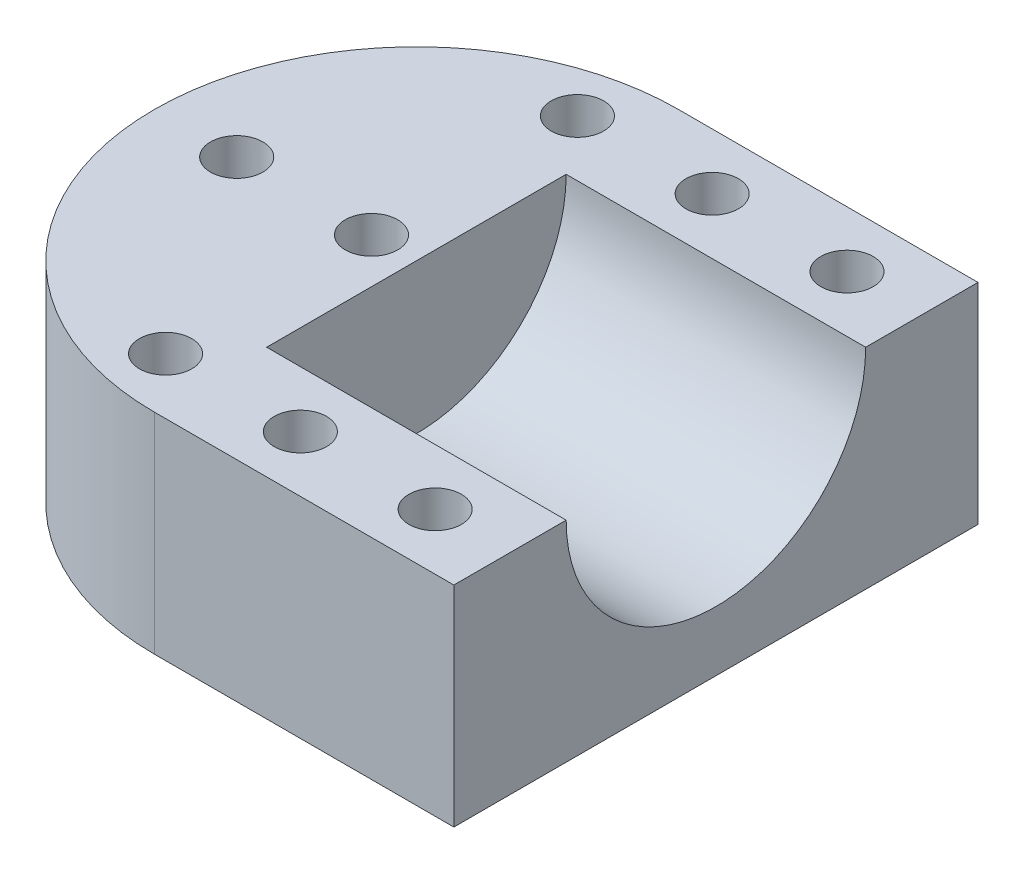
ISO-10303-21;
HEADER;
FILE_DESCRIPTION(('STEP AP214'),'2;1');
FILE_NAME('part.step','',(''),(''),'','','');
FILE_SCHEMA(('AUTOMOTIVE_DESIGN { 1 0 10303 214 1 1 1 1 }'));
ENDSEC;
DATA;
#1=APPLICATION_CONTEXT('core data for automotive mechanical design processes');
#2=APPLICATION_PROTOCOL_DEFINITION('international standard','automotive_design',2000,#1);
#3=PRODUCT_CONTEXT('',#1,'mechanical');
#4=PRODUCT('Part','Part','',(#3));
#5=PRODUCT_RELATED_PRODUCT_CATEGORY('part','',(#4));
#6=PRODUCT_DEFINITION_FORMATION('','',#4);
#7=PRODUCT_DEFINITION_CONTEXT('part definition',#1,'design');
#8=PRODUCT_DEFINITION('design','',#6,#7);
#9=PRODUCT_DEFINITION_SHAPE('','',#8);
#10=(LENGTH_UNIT() NAMED_UNIT(*) SI_UNIT(.MILLI.,.METRE.));
#11=(NAMED_UNIT(*) PLANE_ANGLE_UNIT() SI_UNIT($,.RADIAN.));
#12=(NAMED_UNIT(*) SI_UNIT($,.STERADIAN.) SOLID_ANGLE_UNIT());
#13=UNCERTAINTY_MEASURE_WITH_UNIT(LENGTH_MEASURE(1.E-05),#10,'distance_accuracy_value','');
#14=(GEOMETRIC_REPRESENTATION_CONTEXT(3) GLOBAL_UNCERTAINTY_ASSIGNED_CONTEXT((#13)) GLOBAL_UNIT_ASSIGNED_CONTEXT((#10,
#11,#12)) REPRESENTATION_CONTEXT('',''));
#15=CARTESIAN_POINT('',(0.,0.,0.));
#16=DIRECTION('',(0.,0.,1.));
#17=DIRECTION('',(1.,0.,0.));
#18=AXIS2_PLACEMENT_3D('',#15,#16,#17);
#19=CARTESIAN_POINT('',(15.,-39.,-13.75));
#20=DIRECTION('',(0.,1.,0.));
#21=DIRECTION('',(0.,0.,1.));
#22=AXIS2_PLACEMENT_3D('',#19,#20,#21);
#23=CYLINDRICAL_SURFACE('',#22,1.75);
#24=CARTESIAN_POINT('',(15.,0.,-13.75));
#25=DIRECTION('',(0.,1.,0.));
#26=DIRECTION('',(0.,0.,1.));
#27=AXIS2_PLACEMENT_3D('',#24,#25,#26);
#28=CIRCLE('',#27,1.75);
#29=CARTESIAN_POINT('',(15.,0.,-12.));
#30=VERTEX_POINT('',#29);
#31=EDGE_CURVE('E164',#30,#30,#28,.T.);
#32=ORIENTED_EDGE('',*,*,#31,.T.);
#33=EDGE_LOOP('',(#32));
#34=FACE_BOUND('',#33,.T.);
#35=CARTESIAN_POINT('',(15.,-12.5,-13.75));
#36=DIRECTION('',(0.,-1.,0.));
#37=DIRECTION('',(0.,0.,-1.));
#38=AXIS2_PLACEMENT_3D('',#35,#36,#37);
#39=CIRCLE('',#38,1.75);
#40=CARTESIAN_POINT('',(15.,-12.5,-15.5));
#41=VERTEX_POINT('',#40);
#42=EDGE_CURVE('E45',#41,#41,#39,.F.);
#43=ORIENTED_EDGE('',*,*,#42,.F.);
#44=EDGE_LOOP('',(#43));
#45=FACE_BOUND('',#44,.T.);
#46=ADVANCED_FACE('F41',(#34,#45),#23,.F.);
#47=CARTESIAN_POINT('',(6.,-39.,-13.75));
#48=DIRECTION('',(0.,1.,0.));
#49=DIRECTION('',(0.,0.,1.));
#50=AXIS2_PLACEMENT_3D('',#47,#48,#49);
#51=CYLINDRICAL_SURFACE('',#50,1.75);
#52=CARTESIAN_POINT('',(6.,0.,-13.75));
#53=DIRECTION('',(0.,1.,0.));
#54=DIRECTION('',(0.,0.,1.));
#55=AXIS2_PLACEMENT_3D('',#52,#53,#54);
#56=CIRCLE('',#55,1.75);
#57=CARTESIAN_POINT('',(6.,0.,-12.));
#58=VERTEX_POINT('',#57);
#59=EDGE_CURVE('E166',#58,#58,#56,.T.);
#60=ORIENTED_EDGE('',*,*,#59,.T.);
#61=EDGE_LOOP('',(#60));
#62=FACE_BOUND('',#61,.T.);
#63=CARTESIAN_POINT('',(6.,-12.5,-13.75));
#64=DIRECTION('',(0.,-1.,0.));
#65=DIRECTION('',(0.,0.,-1.));
#66=AXIS2_PLACEMENT_3D('',#63,#64,#65);
#67=CIRCLE('',#66,1.75);
#68=CARTESIAN_POINT('',(6.,-12.5,-15.5));
#69=VERTEX_POINT('',#68);
#70=EDGE_CURVE('E146',#69,#69,#67,.F.);
#71=ORIENTED_EDGE('',*,*,#70,.F.);
#72=EDGE_LOOP('',(#71));
#73=FACE_BOUND('',#72,.T.);
#74=ADVANCED_FACE('F200',(#62,#73),#51,.F.);
#75=CARTESIAN_POINT('',(-3.,-39.,-13.75));
#76=DIRECTION('',(0.,1.,0.));
#77=DIRECTION('',(0.,0.,1.));
#78=AXIS2_PLACEMENT_3D('',#75,#76,#77);
#79=CYLINDRICAL_SURFACE('',#78,1.75);
#80=CARTESIAN_POINT('',(-3.,0.,-13.75));
#81=DIRECTION('',(0.,1.,0.));
#82=DIRECTION('',(0.,0.,1.));
#83=AXIS2_PLACEMENT_3D('',#80,#81,#82);
#84=CIRCLE('',#83,1.75);
#85=CARTESIAN_POINT('',(-3.,0.,-12.));
#86=VERTEX_POINT('',#85);
#87=EDGE_CURVE('E520',#86,#86,#84,.T.);
#88=ORIENTED_EDGE('',*,*,#87,.T.);
#89=EDGE_LOOP('',(#88));
#90=FACE_BOUND('',#89,.T.);
#91=CARTESIAN_POINT('',(-3.,-12.5,-13.75));
#92=DIRECTION('',(0.,-1.,0.));
#93=DIRECTION('',(0.,0.,-1.));
#94=AXIS2_PLACEMENT_3D('',#91,#92,#93);
#95=CIRCLE('',#94,1.75);
#96=CARTESIAN_POINT('',(-3.,-12.5,-15.5));
#97=VERTEX_POINT('',#96);
#98=EDGE_CURVE('E144',#97,#97,#95,.F.);
#99=ORIENTED_EDGE('',*,*,#98,.F.);
#100=EDGE_LOOP('',(#99));
#101=FACE_BOUND('',#100,.T.);
#102=ADVANCED_FACE('F206',(#90,#101),#79,.F.);
#103=CARTESIAN_POINT('',(-3.,-39.,0.));
#104=DIRECTION('',(0.,1.,0.));
#105=DIRECTION('',(0.,0.,1.));
#106=AXIS2_PLACEMENT_3D('',#103,#104,#105);
#107=CYLINDRICAL_SURFACE('',#106,1.75);
#108=CARTESIAN_POINT('',(-3.,0.,0.));
#109=DIRECTION('',(0.,1.,0.));
#110=DIRECTION('',(0.,0.,1.));
#111=AXIS2_PLACEMENT_3D('',#108,#109,#110);
#112=CIRCLE('',#111,1.75);
#113=CARTESIAN_POINT('',(-3.,0.,1.75));
#114=VERTEX_POINT('',#113);
#115=EDGE_CURVE('E516',#114,#114,#112,.T.);
#116=ORIENTED_EDGE('',*,*,#115,.T.);
#117=EDGE_LOOP('',(#116));
#118=FACE_BOUND('',#117,.T.);
#119=CARTESIAN_POINT('',(-3.,-12.5,0.));
#120=DIRECTION('',(0.,-1.,0.));
#121=DIRECTION('',(0.,0.,-1.));
#122=AXIS2_PLACEMENT_3D('',#119,#120,#121);
#123=CIRCLE('',#122,1.75);
#124=CARTESIAN_POINT('',(-3.,-12.5,-1.75));
#125=VERTEX_POINT('',#124);
#126=EDGE_CURVE('E141',#125,#125,#123,.F.);
#127=ORIENTED_EDGE('',*,*,#126,.F.);
#128=EDGE_LOOP('',(#127));
#129=FACE_BOUND('',#128,.T.);
#130=ADVANCED_FACE('F426',(#118,#129),#107,.F.);
#131=CARTESIAN_POINT('',(-12.,-39.,0.));
#132=DIRECTION('',(0.,1.,0.));
#133=DIRECTION('',(0.,0.,1.));
#134=AXIS2_PLACEMENT_3D('',#131,#132,#133);
#135=CYLINDRICAL_SURFACE('',#134,1.75);
#136=CARTESIAN_POINT('',(-12.,0.,0.));
#137=DIRECTION('',(0.,1.,0.));
#138=DIRECTION('',(0.,0.,1.));
#139=AXIS2_PLACEMENT_3D('',#136,#137,#138);
#140=CIRCLE('',#139,1.75);
#141=CARTESIAN_POINT('',(-12.,0.,1.75));
#142=VERTEX_POINT('',#141);
#143=EDGE_CURVE('E512',#142,#142,#140,.T.);
#144=ORIENTED_EDGE('',*,*,#143,.T.);
#145=EDGE_LOOP('',(#144));
#146=FACE_BOUND('',#145,.T.);
#147=CARTESIAN_POINT('',(-12.,-12.5,0.));
#148=DIRECTION('',(0.,-1.,0.));
#149=DIRECTION('',(0.,0.,-1.));
#150=AXIS2_PLACEMENT_3D('',#147,#148,#149);
#151=CIRCLE('',#150,1.75);
#152=CARTESIAN_POINT('',(-12.,-12.5,-1.75));
#153=VERTEX_POINT('',#152);
#154=EDGE_CURVE('E138',#153,#153,#151,.F.);
#155=ORIENTED_EDGE('',*,*,#154,.F.);
#156=EDGE_LOOP('',(#155));
#157=FACE_BOUND('',#156,.T.);
#158=ADVANCED_FACE('F435',(#146,#157),#135,.F.);
#159=CARTESIAN_POINT('',(15.,-39.,13.75));
#160=DIRECTION('',(0.,1.,0.));
#161=DIRECTION('',(0.,0.,1.));
#162=AXIS2_PLACEMENT_3D('',#159,#160,#161);
#163=CYLINDRICAL_SURFACE('',#162,1.75);
#164=CARTESIAN_POINT('',(15.,0.,13.75));
#165=DIRECTION('',(0.,1.,0.));
#166=DIRECTION('',(0.,0.,-1.));
#167=AXIS2_PLACEMENT_3D('',#164,#165,#166);
#168=CIRCLE('',#167,1.75);
#169=CARTESIAN_POINT('',(15.,0.,12.));
#170=VERTEX_POINT('',#169);
#171=EDGE_CURVE('E160',#170,#170,#168,.T.);
#172=ORIENTED_EDGE('',*,*,#171,.T.);
#173=EDGE_LOOP('',(#172));
#174=FACE_BOUND('',#173,.T.);
#175=CARTESIAN_POINT('',(15.,-12.5,13.75));
#176=DIRECTION('',(0.,-1.,0.));
#177=DIRECTION('',(0.,0.,-1.));
#178=AXIS2_PLACEMENT_3D('',#175,#176,#177);
#179=CIRCLE('',#178,1.75);
#180=CARTESIAN_POINT('',(15.,-12.5,12.));
#181=VERTEX_POINT('',#180);
#182=EDGE_CURVE('E135',#181,#181,#179,.F.);
#183=ORIENTED_EDGE('',*,*,#182,.F.);
#184=EDGE_LOOP('',(#183));
#185=FACE_BOUND('',#184,.T.);
#186=ADVANCED_FACE('F444',(#174,#185),#163,.F.);
#187=CARTESIAN_POINT('',(6.,-39.,13.75));
#188=DIRECTION('',(0.,1.,0.));
#189=DIRECTION('',(0.,0.,1.));
#190=AXIS2_PLACEMENT_3D('',#187,#188,#189);
#191=CYLINDRICAL_SURFACE('',#190,1.75);
#192=CARTESIAN_POINT('',(6.,0.,13.75));
#193=DIRECTION('',(0.,1.,0.));
#194=DIRECTION('',(0.,0.,-1.));
#195=AXIS2_PLACEMENT_3D('',#192,#193,#194);
#196=CIRCLE('',#195,1.75);
#197=CARTESIAN_POINT('',(6.,0.,12.));
#198=VERTEX_POINT('',#197);
#199=EDGE_CURVE('E155',#198,#198,#196,.T.);
#200=ORIENTED_EDGE('',*,*,#199,.T.);
#201=EDGE_LOOP('',(#200));
#202=FACE_BOUND('',#201,.T.);
#203=CARTESIAN_POINT('',(6.,-12.5,13.75));
#204=DIRECTION('',(0.,-1.,0.));
#205=DIRECTION('',(0.,0.,-1.));
#206=AXIS2_PLACEMENT_3D('',#203,#204,#205);
#207=CIRCLE('',#206,1.75);
#208=CARTESIAN_POINT('',(6.,-12.5,12.));
#209=VERTEX_POINT('',#208);
#210=EDGE_CURVE('E131',#209,#209,#207,.F.);
#211=ORIENTED_EDGE('',*,*,#210,.F.);
#212=EDGE_LOOP('',(#211));
#213=FACE_BOUND('',#212,.T.);
#214=ADVANCED_FACE('F197',(#202,#213),#191,.F.);
#215=CARTESIAN_POINT('',(-3.,-39.,13.75));
#216=DIRECTION('',(0.,1.,0.));
#217=DIRECTION('',(0.,0.,1.));
#218=AXIS2_PLACEMENT_3D('',#215,#216,#217);
#219=CYLINDRICAL_SURFACE('',#218,1.74999999999999);
#220=CARTESIAN_POINT('',(-3.,0.,13.75));
#221=DIRECTION('',(0.,1.,0.));
#222=DIRECTION('',(0.,0.,-1.));
#223=AXIS2_PLACEMENT_3D('',#220,#221,#222);
#224=CIRCLE('',#223,1.74999999999999);
#225=CARTESIAN_POINT('',(-3.,0.,12.));
#226=VERTEX_POINT('',#225);
#227=EDGE_CURVE('E151',#226,#226,#224,.T.);
#228=ORIENTED_EDGE('',*,*,#227,.T.);
#229=EDGE_LOOP('',(#228));
#230=FACE_BOUND('',#229,.T.);
#231=CARTESIAN_POINT('',(-3.,-12.5,13.75));
#232=DIRECTION('',(0.,-1.,0.));
#233=DIRECTION('',(0.,0.,-1.));
#234=AXIS2_PLACEMENT_3D('',#231,#232,#233);
#235=CIRCLE('',#234,1.74999999999999);
#236=CARTESIAN_POINT('',(-3.,-12.5,12.));
#237=VERTEX_POINT('',#236);
#238=EDGE_CURVE('E128',#237,#237,#235,.F.);
#239=ORIENTED_EDGE('',*,*,#238,.F.);
#240=EDGE_LOOP('',(#239));
#241=FACE_BOUND('',#240,.T.);
#242=ADVANCED_FACE('F191',(#230,#241),#219,.F.);
#243=CARTESIAN_POINT('',(0.,-14.,0.));
#244=DIRECTION('',(0.,1.,0.));
#245=DIRECTION('',(0.,0.,1.));
#246=AXIS2_PLACEMENT_3D('',#243,#244,#245);
#247=CYLINDRICAL_SURFACE('',#246,17.5);
#248=CARTESIAN_POINT('',(0.,0.,0.));
#249=DIRECTION('',(0.,-1.,0.));
#250=DIRECTION('',(0.,0.,-1.));
#251=AXIS2_PLACEMENT_3D('',#248,#249,#250);
#252=CIRCLE('',#251,17.5);
#253=CARTESIAN_POINT('',(0.,0.,-17.5));
#254=VERTEX_POINT('',#253);
#255=CARTESIAN_POINT('',(0.,0.,17.5));
#256=VERTEX_POINT('',#255);
#257=EDGE_CURVE('E98',#254,#256,#252,.F.);
#258=ORIENTED_EDGE('',*,*,#257,.F.);
#259=DIRECTION('',(0.,1.,0.));
#260=VECTOR('',#259,1.);
#261=CARTESIAN_POINT('',(0.,-14.,-17.5));
#262=LINE('',#261,#260);
#263=CARTESIAN_POINT('',(0.,-14.,-17.5));
#264=VERTEX_POINT('',#263);
#265=EDGE_CURVE('E50',#264,#254,#262,.T.);
#266=ORIENTED_EDGE('',*,*,#265,.F.);
#267=CARTESIAN_POINT('',(0.,-14.,0.));
#268=DIRECTION('',(0.,1.,0.));
#269=DIRECTION('',(0.,0.,1.));
#270=AXIS2_PLACEMENT_3D('',#267,#268,#269);
#271=CIRCLE('',#270,17.5);
#272=CARTESIAN_POINT('',(0.,-14.,17.5));
#273=VERTEX_POINT('',#272);
#274=EDGE_CURVE('E178',#264,#273,#271,.T.);
#275=ORIENTED_EDGE('',*,*,#274,.T.);
#276=DIRECTION('',(0.,1.,0.));
#277=VECTOR('',#276,1.);
#278=CARTESIAN_POINT('',(0.,-14.,17.5));
#279=LINE('',#278,#277);
#280=EDGE_CURVE('E121',#273,#256,#279,.T.);
#281=ORIENTED_EDGE('',*,*,#280,.T.);
#282=EDGE_LOOP('',(#258,#266,#275,#281));
#283=FACE_BOUND('',#282,.T.);
#284=ADVANCED_FACE('F43',(#283),#247,.T.);
#285=CARTESIAN_POINT('',(0.,-14.,-17.5));
#286=DIRECTION('',(0.,0.,1.));
#287=DIRECTION('',(1.,0.,0.));
#288=AXIS2_PLACEMENT_3D('',#285,#286,#287);
#289=PLANE('',#288);
#290=ORIENTED_EDGE('',*,*,#265,.T.);
#291=DIRECTION('',(1.,0.,0.));
#292=VECTOR('',#291,1.);
#293=CARTESIAN_POINT('',(0.,0.,-17.5));
#294=LINE('',#293,#292);
#295=CARTESIAN_POINT('',(20.,0.,-17.5));
#296=VERTEX_POINT('',#295);
#297=EDGE_CURVE('E172',#254,#296,#294,.T.);
#298=ORIENTED_EDGE('',*,*,#297,.T.);
#299=DIRECTION('',(0.,1.,0.));
#300=VECTOR('',#299,1.);
#301=CARTESIAN_POINT('',(20.,-14.,-17.5));
#302=LINE('',#301,#300);
#303=CARTESIAN_POINT('',(20.,-14.,-17.5));
#304=VERTEX_POINT('',#303);
#305=EDGE_CURVE('E120',#304,#296,#302,.T.);
#306=ORIENTED_EDGE('',*,*,#305,.F.);
#307=DIRECTION('',(1.,0.,0.));
#308=VECTOR('',#307,1.);
#309=CARTESIAN_POINT('',(0.,-14.,-17.5));
#310=LINE('',#309,#308);
#311=EDGE_CURVE('E124',#264,#304,#310,.T.);
#312=ORIENTED_EDGE('',*,*,#311,.F.);
#313=EDGE_LOOP('',(#290,#298,#306,#312));
#314=FACE_BOUND('',#313,.T.);
#315=ADVANCED_FACE('F185',(#314),#289,.F.);
#316=CARTESIAN_POINT('',(20.,-14.,0.));
#317=DIRECTION('',(-1.,0.,0.));
#318=DIRECTION('',(0.,0.,1.));
#319=AXIS2_PLACEMENT_3D('',#316,#317,#318);
#320=PLANE('',#319);
#321=ORIENTED_EDGE('',*,*,#305,.T.);
#322=DIRECTION('',(0.,0.,-1.));
#323=VECTOR('',#322,1.);
#324=CARTESIAN_POINT('',(20.,0.,29.4883371809806));
#325=LINE('',#324,#323);
#326=CARTESIAN_POINT('',(20.,0.,-10.));
#327=VERTEX_POINT('',#326);
#328=EDGE_CURVE('E115',#327,#296,#325,.T.);
#329=ORIENTED_EDGE('',*,*,#328,.F.);
#330=CARTESIAN_POINT('',(20.,0.,0.));
#331=DIRECTION('',(1.,0.,0.));
#332=DIRECTION('',(0.,0.,-1.));
#333=AXIS2_PLACEMENT_3D('',#330,#331,#332);
#334=CIRCLE('',#333,10.);
#335=CARTESIAN_POINT('',(20.,0.,10.));
#336=VERTEX_POINT('',#335);
#337=EDGE_CURVE('E114',#336,#327,#334,.T.);
#338=ORIENTED_EDGE('',*,*,#337,.F.);
#339=CARTESIAN_POINT('',(20.,0.,17.5));
#340=VERTEX_POINT('',#339);
#341=EDGE_CURVE('E97',#340,#336,#325,.T.);
#342=ORIENTED_EDGE('',*,*,#341,.F.);
#343=DIRECTION('',(0.,1.,0.));
#344=VECTOR('',#343,1.);
#345=CARTESIAN_POINT('',(20.,-14.,17.5));
#346=LINE('',#345,#344);
#347=CARTESIAN_POINT('',(20.,-14.,17.5));
#348=VERTEX_POINT('',#347);
#349=EDGE_CURVE('E110',#348,#340,#346,.T.);
#350=ORIENTED_EDGE('',*,*,#349,.F.);
#351=DIRECTION('',(0.,0.,1.));
#352=VECTOR('',#351,1.);
#353=CARTESIAN_POINT('',(20.,-14.,0.));
#354=LINE('',#353,#352);
#355=EDGE_CURVE('E182',#304,#348,#354,.T.);
#356=ORIENTED_EDGE('',*,*,#355,.F.);
#357=EDGE_LOOP('',(#321,#329,#338,#342,#350,#356));
#358=FACE_BOUND('',#357,.T.);
#359=ADVANCED_FACE('F108',(#358),#320,.F.);
#360=CARTESIAN_POINT('',(0.,-14.,17.5));
#361=DIRECTION('',(0.,0.,1.));
#362=DIRECTION('',(1.,0.,0.));
#363=AXIS2_PLACEMENT_3D('',#360,#361,#362);
#364=PLANE('',#363);
#365=DIRECTION('',(1.,0.,0.));
#366=VECTOR('',#365,1.);
#367=CARTESIAN_POINT('',(0.,0.,17.5));
#368=LINE('',#367,#366);
#369=EDGE_CURVE('E94',#256,#340,#368,.T.);
#370=ORIENTED_EDGE('',*,*,#369,.F.);
#371=ORIENTED_EDGE('',*,*,#280,.F.);
#372=DIRECTION('',(1.,0.,0.));
#373=VECTOR('',#372,1.);
#374=CARTESIAN_POINT('',(0.,-14.,17.5));
#375=LINE('',#374,#373);
#376=EDGE_CURVE('E119',#273,#348,#375,.T.);
#377=ORIENTED_EDGE('',*,*,#376,.T.);
#378=ORIENTED_EDGE('',*,*,#349,.T.);
#379=EDGE_LOOP('',(#370,#371,#377,#378));
#380=FACE_BOUND('',#379,.T.);
#381=ADVANCED_FACE('F117',(#380),#364,.T.);
#382=CARTESIAN_POINT('',(0.,-14.,0.));
#383=DIRECTION('',(0.,1.,0.));
#384=DIRECTION('',(0.,0.,1.));
#385=AXIS2_PLACEMENT_3D('',#382,#383,#384);
#386=PLANE('',#385);
#387=CARTESIAN_POINT('',(15.,-14.,-13.75));
#388=DIRECTION('',(0.,-1.,0.));
#389=DIRECTION('',(0.,0.,-1.));
#390=AXIS2_PLACEMENT_3D('',#387,#388,#389);
#391=CIRCLE('',#390,3.25);
#392=CARTESIAN_POINT('',(15.,-14.,-17.));
#393=VERTEX_POINT('',#392);
#394=EDGE_CURVE('E545',#393,#393,#391,.T.);
#395=ORIENTED_EDGE('',*,*,#394,.F.);
#396=EDGE_LOOP('',(#395));
#397=FACE_BOUND('',#396,.T.);
#398=CARTESIAN_POINT('',(6.,-14.,-13.75));
#399=DIRECTION('',(0.,-1.,0.));
#400=DIRECTION('',(0.,0.,-1.));
#401=AXIS2_PLACEMENT_3D('',#398,#399,#400);
#402=CIRCLE('',#401,3.25);
#403=CARTESIAN_POINT('',(6.,-14.,-17.));
#404=VERTEX_POINT('',#403);
#405=EDGE_CURVE('E551',#404,#404,#402,.T.);
#406=ORIENTED_EDGE('',*,*,#405,.F.);
#407=EDGE_LOOP('',(#406));
#408=FACE_BOUND('',#407,.T.);
#409=CARTESIAN_POINT('',(-3.,-14.,-13.75));
#410=DIRECTION('',(0.,-1.,0.));
#411=DIRECTION('',(0.,0.,-1.));
#412=AXIS2_PLACEMENT_3D('',#409,#410,#411);
#413=CIRCLE('',#412,3.25);
#414=CARTESIAN_POINT('',(-3.,-14.,-17.));
#415=VERTEX_POINT('',#414);
#416=EDGE_CURVE('E557',#415,#415,#413,.T.);
#417=ORIENTED_EDGE('',*,*,#416,.F.);
#418=EDGE_LOOP('',(#417));
#419=FACE_BOUND('',#418,.T.);
#420=CARTESIAN_POINT('',(-3.,-14.,0.));
#421=DIRECTION('',(0.,-1.,0.));
#422=DIRECTION('',(0.,0.,-1.));
#423=AXIS2_PLACEMENT_3D('',#420,#421,#422);
#424=CIRCLE('',#423,3.25);
#425=CARTESIAN_POINT('',(-3.,-14.,-3.25));
#426=VERTEX_POINT('',#425);
#427=EDGE_CURVE('E563',#426,#426,#424,.T.);
#428=ORIENTED_EDGE('',*,*,#427,.F.);
#429=EDGE_LOOP('',(#428));
#430=FACE_BOUND('',#429,.T.);
#431=CARTESIAN_POINT('',(-12.,-14.,0.));
#432=DIRECTION('',(0.,-1.,0.));
#433=DIRECTION('',(0.,0.,-1.));
#434=AXIS2_PLACEMENT_3D('',#431,#432,#433);
#435=CIRCLE('',#434,3.25);
#436=CARTESIAN_POINT('',(-12.,-14.,-3.25));
#437=VERTEX_POINT('',#436);
#438=EDGE_CURVE('E569',#437,#437,#435,.T.);
#439=ORIENTED_EDGE('',*,*,#438,.F.);
#440=EDGE_LOOP('',(#439));
#441=FACE_BOUND('',#440,.T.);
#442=CARTESIAN_POINT('',(15.,-14.,13.75));
#443=DIRECTION('',(0.,-1.,0.));
#444=DIRECTION('',(0.,0.,-1.));
#445=AXIS2_PLACEMENT_3D('',#442,#443,#444);
#446=CIRCLE('',#445,3.25);
#447=CARTESIAN_POINT('',(15.,-14.,10.5));
#448=VERTEX_POINT('',#447);
#449=EDGE_CURVE('E575',#448,#448,#446,.T.);
#450=ORIENTED_EDGE('',*,*,#449,.F.);
#451=EDGE_LOOP('',(#450));
#452=FACE_BOUND('',#451,.T.);
#453=CARTESIAN_POINT('',(6.,-14.,13.75));
#454=DIRECTION('',(0.,-1.,0.));
#455=DIRECTION('',(0.,0.,-1.));
#456=AXIS2_PLACEMENT_3D('',#453,#454,#455);
#457=CIRCLE('',#456,3.25);
#458=CARTESIAN_POINT('',(6.,-14.,10.5));
#459=VERTEX_POINT('',#458);
#460=EDGE_CURVE('E581',#459,#459,#457,.T.);
#461=ORIENTED_EDGE('',*,*,#460,.F.);
#462=EDGE_LOOP('',(#461));
#463=FACE_BOUND('',#462,.T.);
#464=CARTESIAN_POINT('',(-3.,-14.,13.75));
#465=DIRECTION('',(0.,-1.,0.));
#466=DIRECTION('',(0.,0.,-1.));
#467=AXIS2_PLACEMENT_3D('',#464,#465,#466);
#468=CIRCLE('',#467,3.25);
#469=CARTESIAN_POINT('',(-3.,-14.,10.5));
#470=VERTEX_POINT('',#469);
#471=EDGE_CURVE('E528',#470,#470,#468,.T.);
#472=ORIENTED_EDGE('',*,*,#471,.F.);
#473=EDGE_LOOP('',(#472));
#474=FACE_BOUND('',#473,.T.);
#475=ORIENTED_EDGE('',*,*,#274,.F.);
#476=ORIENTED_EDGE('',*,*,#311,.T.);
#477=ORIENTED_EDGE('',*,*,#355,.T.);
#478=ORIENTED_EDGE('',*,*,#376,.F.);
#479=EDGE_LOOP('',(#475,#476,#477,#478));
#480=FACE_BOUND('',#479,.T.);
#481=ADVANCED_FACE('F189',(#397,#408,#419,#430,#441,#452,#463,#474,#480),#386,.F.);
#482=CARTESIAN_POINT('',(0.,0.,0.));
#483=DIRECTION('',(1.,0.,0.));
#484=DIRECTION('',(0.,0.,-1.));
#485=AXIS2_PLACEMENT_3D('',#482,#483,#484);
#486=CYLINDRICAL_SURFACE('',#485,10.);
#487=ORIENTED_EDGE('',*,*,#337,.T.);
#488=DIRECTION('',(1.,0.,0.));
#489=VECTOR('',#488,1.);
#490=CARTESIAN_POINT('',(0.,0.,-10.));
#491=LINE('',#490,#489);
#492=CARTESIAN_POINT('',(0.,0.,-10.));
#493=VERTEX_POINT('',#492);
#494=EDGE_CURVE('E102',#327,#493,#491,.F.);
#495=ORIENTED_EDGE('',*,*,#494,.T.);
#496=CARTESIAN_POINT('',(0.,0.,0.));
#497=DIRECTION('',(1.,0.,0.));
#498=DIRECTION('',(0.,0.,-1.));
#499=AXIS2_PLACEMENT_3D('',#496,#497,#498);
#500=CIRCLE('',#499,10.);
#501=CARTESIAN_POINT('',(0.,0.,10.));
#502=VERTEX_POINT('',#501);
#503=EDGE_CURVE('E175',#502,#493,#500,.T.);
#504=ORIENTED_EDGE('',*,*,#503,.F.);
#505=DIRECTION('',(1.,0.,0.));
#506=VECTOR('',#505,1.);
#507=CARTESIAN_POINT('',(0.,0.,10.));
#508=LINE('',#507,#506);
#509=EDGE_CURVE('E57',#502,#336,#508,.T.);
#510=ORIENTED_EDGE('',*,*,#509,.T.);
#511=EDGE_LOOP('',(#487,#495,#504,#510));
#512=FACE_BOUND('',#511,.T.);
#513=ADVANCED_FACE('F219',(#512),#486,.F.);
#514=CARTESIAN_POINT('',(0.,0.,0.));
#515=DIRECTION('',(1.,0.,0.));
#516=DIRECTION('',(0.,0.,-1.));
#517=AXIS2_PLACEMENT_3D('',#514,#515,#516);
#518=PLANE('',#517);
#519=DIRECTION('',(0.,0.,-1.));
#520=VECTOR('',#519,1.);
#521=CARTESIAN_POINT('',(0.,0.,0.));
#522=LINE('',#521,#520);
#523=EDGE_CURVE('E11',#502,#493,#522,.T.);
#524=ORIENTED_EDGE('',*,*,#523,.F.);
#525=ORIENTED_EDGE('',*,*,#503,.T.);
#526=EDGE_LOOP('',(#524,#525));
#527=FACE_BOUND('',#526,.T.);
#528=ADVANCED_FACE('F215',(#527),#518,.T.);
#529=CARTESIAN_POINT('',(-19.,0.,29.4883371809806));
#530=DIRECTION('',(0.,-1.,0.));
#531=DIRECTION('',(0.,0.,-1.));
#532=AXIS2_PLACEMENT_3D('',#529,#530,#531);
#533=PLANE('',#532);
#534=ORIENTED_EDGE('',*,*,#227,.F.);
#535=EDGE_LOOP('',(#534));
#536=FACE_BOUND('',#535,.T.);
#537=ORIENTED_EDGE('',*,*,#199,.F.);
#538=EDGE_LOOP('',(#537));
#539=FACE_BOUND('',#538,.T.);
#540=ORIENTED_EDGE('',*,*,#171,.F.);
#541=EDGE_LOOP('',(#540));
#542=FACE_BOUND('',#541,.T.);
#543=ORIENTED_EDGE('',*,*,#143,.F.);
#544=EDGE_LOOP('',(#543));
#545=FACE_BOUND('',#544,.T.);
#546=ORIENTED_EDGE('',*,*,#115,.F.);
#547=EDGE_LOOP('',(#546));
#548=FACE_BOUND('',#547,.T.);
#549=ORIENTED_EDGE('',*,*,#87,.F.);
#550=EDGE_LOOP('',(#549));
#551=FACE_BOUND('',#550,.T.);
#552=ORIENTED_EDGE('',*,*,#59,.F.);
#553=EDGE_LOOP('',(#552));
#554=FACE_BOUND('',#553,.T.);
#555=ORIENTED_EDGE('',*,*,#31,.F.);
#556=EDGE_LOOP('',(#555));
#557=FACE_BOUND('',#556,.T.);
#558=ORIENTED_EDGE('',*,*,#257,.T.);
#559=ORIENTED_EDGE('',*,*,#369,.T.);
#560=ORIENTED_EDGE('',*,*,#341,.T.);
#561=ORIENTED_EDGE('',*,*,#509,.F.);
#562=ORIENTED_EDGE('',*,*,#523,.T.);
#563=ORIENTED_EDGE('',*,*,#494,.F.);
#564=ORIENTED_EDGE('',*,*,#328,.T.);
#565=ORIENTED_EDGE('',*,*,#297,.F.);
#566=EDGE_LOOP('',(#558,#559,#560,#561,#562,#563,#564,#565));
#567=FACE_BOUND('',#566,.T.);
#568=ADVANCED_FACE('F96',(#536,#539,#542,#545,#548,#551,#554,#557,#567),#533,.F.);
#569=CARTESIAN_POINT('',(-3.,-12.5,13.75));
#570=DIRECTION('',(0.,-1.,0.));
#571=DIRECTION('',(0.,0.,-1.));
#572=AXIS2_PLACEMENT_3D('',#569,#570,#571);
#573=PLANE('',#572);
#574=CARTESIAN_POINT('',(-3.,-12.5,13.75));
#575=DIRECTION('',(0.,-1.,0.));
#576=DIRECTION('',(0.,0.,-1.));
#577=AXIS2_PLACEMENT_3D('',#574,#575,#576);
#578=CIRCLE('',#577,3.25);
#579=CARTESIAN_POINT('',(-3.,-12.5,10.5));
#580=VERTEX_POINT('',#579);
#581=EDGE_CURVE('E132',#580,#580,#578,.T.);
#582=ORIENTED_EDGE('',*,*,#581,.T.);
#583=EDGE_LOOP('',(#582));
#584=FACE_BOUND('',#583,.T.);
#585=ORIENTED_EDGE('',*,*,#238,.T.);
#586=EDGE_LOOP('',(#585));
#587=FACE_BOUND('',#586,.T.);
#588=ADVANCED_FACE('F214',(#584,#587),#573,.T.);
#589=CARTESIAN_POINT('',(-3.,-12.5,13.75));
#590=DIRECTION('',(0.,-1.,0.));
#591=DIRECTION('',(0.,0.,-1.));
#592=AXIS2_PLACEMENT_3D('',#589,#590,#591);
#593=CYLINDRICAL_SURFACE('',#592,3.25);
#594=ORIENTED_EDGE('',*,*,#581,.F.);
#595=EDGE_LOOP('',(#594));
#596=FACE_BOUND('',#595,.T.);
#597=ORIENTED_EDGE('',*,*,#471,.T.);
#598=EDGE_LOOP('',(#597));
#599=FACE_BOUND('',#598,.T.);
#600=ADVANCED_FACE('F256',(#596,#599),#593,.F.);
#601=CARTESIAN_POINT('',(6.,-12.5,13.75));
#602=DIRECTION('',(0.,-1.,0.));
#603=DIRECTION('',(0.,0.,-1.));
#604=AXIS2_PLACEMENT_3D('',#601,#602,#603);
#605=PLANE('',#604);
#606=CARTESIAN_POINT('',(6.,-12.5,13.75));
#607=DIRECTION('',(0.,-1.,0.));
#608=DIRECTION('',(0.,0.,-1.));
#609=AXIS2_PLACEMENT_3D('',#606,#607,#608);
#610=CIRCLE('',#609,3.25);
#611=CARTESIAN_POINT('',(6.,-12.5,10.5));
#612=VERTEX_POINT('',#611);
#613=EDGE_CURVE('E542',#612,#612,#610,.T.);
#614=ORIENTED_EDGE('',*,*,#613,.T.);
#615=EDGE_LOOP('',(#614));
#616=FACE_BOUND('',#615,.T.);
#617=ORIENTED_EDGE('',*,*,#210,.T.);
#618=EDGE_LOOP('',(#617));
#619=FACE_BOUND('',#618,.T.);
#620=ADVANCED_FACE('F264',(#616,#619),#605,.T.);
#621=CARTESIAN_POINT('',(6.,-12.5,13.75));
#622=DIRECTION('',(0.,-1.,0.));
#623=DIRECTION('',(0.,0.,-1.));
#624=AXIS2_PLACEMENT_3D('',#621,#622,#623);
#625=CYLINDRICAL_SURFACE('',#624,3.25);
#626=ORIENTED_EDGE('',*,*,#613,.F.);
#627=EDGE_LOOP('',(#626));
#628=FACE_BOUND('',#627,.T.);
#629=ORIENTED_EDGE('',*,*,#460,.T.);
#630=EDGE_LOOP('',(#629));
#631=FACE_BOUND('',#630,.T.);
#632=ADVANCED_FACE('F272',(#628,#631),#625,.F.);
#633=CARTESIAN_POINT('',(15.,-12.5,13.75));
#634=DIRECTION('',(0.,-1.,0.));
#635=DIRECTION('',(0.,0.,-1.));
#636=AXIS2_PLACEMENT_3D('',#633,#634,#635);
#637=PLANE('',#636);
#638=CARTESIAN_POINT('',(15.,-12.5,13.75));
#639=DIRECTION('',(0.,-1.,0.));
#640=DIRECTION('',(0.,0.,-1.));
#641=AXIS2_PLACEMENT_3D('',#638,#639,#640);
#642=CIRCLE('',#641,3.25);
#643=CARTESIAN_POINT('',(15.,-12.5,10.5));
#644=VERTEX_POINT('',#643);
#645=EDGE_CURVE('E578',#644,#644,#642,.T.);
#646=ORIENTED_EDGE('',*,*,#645,.T.);
#647=EDGE_LOOP('',(#646));
#648=FACE_BOUND('',#647,.T.);
#649=ORIENTED_EDGE('',*,*,#182,.T.);
#650=EDGE_LOOP('',(#649));
#651=FACE_BOUND('',#650,.T.);
#652=ADVANCED_FACE('F280',(#648,#651),#637,.T.);
#653=CARTESIAN_POINT('',(15.,-12.5,13.75));
#654=DIRECTION('',(0.,-1.,0.));
#655=DIRECTION('',(0.,0.,-1.));
#656=AXIS2_PLACEMENT_3D('',#653,#654,#655);
#657=CYLINDRICAL_SURFACE('',#656,3.25);
#658=ORIENTED_EDGE('',*,*,#645,.F.);
#659=EDGE_LOOP('',(#658));
#660=FACE_BOUND('',#659,.T.);
#661=ORIENTED_EDGE('',*,*,#449,.T.);
#662=EDGE_LOOP('',(#661));
#663=FACE_BOUND('',#662,.T.);
#664=ADVANCED_FACE('F288',(#660,#663),#657,.F.);
#665=CARTESIAN_POINT('',(-12.,-12.5,0.));
#666=DIRECTION('',(0.,-1.,0.));
#667=DIRECTION('',(0.,0.,-1.));
#668=AXIS2_PLACEMENT_3D('',#665,#666,#667);
#669=PLANE('',#668);
#670=CARTESIAN_POINT('',(-12.,-12.5,0.));
#671=DIRECTION('',(0.,-1.,0.));
#672=DIRECTION('',(0.,0.,-1.));
#673=AXIS2_PLACEMENT_3D('',#670,#671,#672);
#674=CIRCLE('',#673,3.25);
#675=CARTESIAN_POINT('',(-12.,-12.5,-3.25));
#676=VERTEX_POINT('',#675);
#677=EDGE_CURVE('E572',#676,#676,#674,.T.);
#678=ORIENTED_EDGE('',*,*,#677,.T.);
#679=EDGE_LOOP('',(#678));
#680=FACE_BOUND('',#679,.T.);
#681=ORIENTED_EDGE('',*,*,#154,.T.);
#682=EDGE_LOOP('',(#681));
#683=FACE_BOUND('',#682,.T.);
#684=ADVANCED_FACE('F296',(#680,#683),#669,.T.);
#685=CARTESIAN_POINT('',(-12.,-12.5,0.));
#686=DIRECTION('',(0.,-1.,0.));
#687=DIRECTION('',(0.,0.,-1.));
#688=AXIS2_PLACEMENT_3D('',#685,#686,#687);
#689=CYLINDRICAL_SURFACE('',#688,3.25);
#690=ORIENTED_EDGE('',*,*,#677,.F.);
#691=EDGE_LOOP('',(#690));
#692=FACE_BOUND('',#691,.T.);
#693=ORIENTED_EDGE('',*,*,#438,.T.);
#694=EDGE_LOOP('',(#693));
#695=FACE_BOUND('',#694,.T.);
#696=ADVANCED_FACE('F304',(#692,#695),#689,.F.);
#697=CARTESIAN_POINT('',(-3.,-12.5,0.));
#698=DIRECTION('',(0.,-1.,0.));
#699=DIRECTION('',(0.,0.,-1.));
#700=AXIS2_PLACEMENT_3D('',#697,#698,#699);
#701=PLANE('',#700);
#702=CARTESIAN_POINT('',(-3.,-12.5,0.));
#703=DIRECTION('',(0.,-1.,0.));
#704=DIRECTION('',(0.,0.,-1.));
#705=AXIS2_PLACEMENT_3D('',#702,#703,#704);
#706=CIRCLE('',#705,3.25);
#707=CARTESIAN_POINT('',(-3.,-12.5,-3.25));
#708=VERTEX_POINT('',#707);
#709=EDGE_CURVE('E566',#708,#708,#706,.T.);
#710=ORIENTED_EDGE('',*,*,#709,.T.);
#711=EDGE_LOOP('',(#710));
#712=FACE_BOUND('',#711,.T.);
#713=ORIENTED_EDGE('',*,*,#126,.T.);
#714=EDGE_LOOP('',(#713));
#715=FACE_BOUND('',#714,.T.);
#716=ADVANCED_FACE('F312',(#712,#715),#701,.T.);
#717=CARTESIAN_POINT('',(-3.,-12.5,0.));
#718=DIRECTION('',(0.,-1.,0.));
#719=DIRECTION('',(0.,0.,-1.));
#720=AXIS2_PLACEMENT_3D('',#717,#718,#719);
#721=CYLINDRICAL_SURFACE('',#720,3.25);
#722=ORIENTED_EDGE('',*,*,#709,.F.);
#723=EDGE_LOOP('',(#722));
#724=FACE_BOUND('',#723,.T.);
#725=ORIENTED_EDGE('',*,*,#427,.T.);
#726=EDGE_LOOP('',(#725));
#727=FACE_BOUND('',#726,.T.);
#728=ADVANCED_FACE('F320',(#724,#727),#721,.F.);
#729=CARTESIAN_POINT('',(-3.,-12.5,-13.75));
#730=DIRECTION('',(0.,-1.,0.));
#731=DIRECTION('',(0.,0.,-1.));
#732=AXIS2_PLACEMENT_3D('',#729,#730,#731);
#733=PLANE('',#732);
#734=CARTESIAN_POINT('',(-3.,-12.5,-13.75));
#735=DIRECTION('',(0.,-1.,0.));
#736=DIRECTION('',(0.,0.,-1.));
#737=AXIS2_PLACEMENT_3D('',#734,#735,#736);
#738=CIRCLE('',#737,3.25);
#739=CARTESIAN_POINT('',(-3.,-12.5,-17.));
#740=VERTEX_POINT('',#739);
#741=EDGE_CURVE('E560',#740,#740,#738,.T.);
#742=ORIENTED_EDGE('',*,*,#741,.T.);
#743=EDGE_LOOP('',(#742));
#744=FACE_BOUND('',#743,.T.);
#745=ORIENTED_EDGE('',*,*,#98,.T.);
#746=EDGE_LOOP('',(#745));
#747=FACE_BOUND('',#746,.T.);
#748=ADVANCED_FACE('F328',(#744,#747),#733,.T.);
#749=CARTESIAN_POINT('',(-3.,-12.5,-13.75));
#750=DIRECTION('',(0.,-1.,0.));
#751=DIRECTION('',(0.,0.,-1.));
#752=AXIS2_PLACEMENT_3D('',#749,#750,#751);
#753=CYLINDRICAL_SURFACE('',#752,3.25);
#754=ORIENTED_EDGE('',*,*,#741,.F.);
#755=EDGE_LOOP('',(#754));
#756=FACE_BOUND('',#755,.T.);
#757=ORIENTED_EDGE('',*,*,#416,.T.);
#758=EDGE_LOOP('',(#757));
#759=FACE_BOUND('',#758,.T.);
#760=ADVANCED_FACE('F336',(#756,#759),#753,.F.);
#761=CARTESIAN_POINT('',(6.,-12.5,-13.75));
#762=DIRECTION('',(0.,-1.,0.));
#763=DIRECTION('',(0.,0.,-1.));
#764=AXIS2_PLACEMENT_3D('',#761,#762,#763);
#765=PLANE('',#764);
#766=CARTESIAN_POINT('',(6.,-12.5,-13.75));
#767=DIRECTION('',(0.,-1.,0.));
#768=DIRECTION('',(0.,0.,-1.));
#769=AXIS2_PLACEMENT_3D('',#766,#767,#768);
#770=CIRCLE('',#769,3.25);
#771=CARTESIAN_POINT('',(6.,-12.5,-17.));
#772=VERTEX_POINT('',#771);
#773=EDGE_CURVE('E554',#772,#772,#770,.T.);
#774=ORIENTED_EDGE('',*,*,#773,.T.);
#775=EDGE_LOOP('',(#774));
#776=FACE_BOUND('',#775,.T.);
#777=ORIENTED_EDGE('',*,*,#70,.T.);
#778=EDGE_LOOP('',(#777));
#779=FACE_BOUND('',#778,.T.);
#780=ADVANCED_FACE('F344',(#776,#779),#765,.T.);
#781=CARTESIAN_POINT('',(6.,-12.5,-13.75));
#782=DIRECTION('',(0.,-1.,0.));
#783=DIRECTION('',(0.,0.,-1.));
#784=AXIS2_PLACEMENT_3D('',#781,#782,#783);
#785=CYLINDRICAL_SURFACE('',#784,3.25);
#786=ORIENTED_EDGE('',*,*,#773,.F.);
#787=EDGE_LOOP('',(#786));
#788=FACE_BOUND('',#787,.T.);
#789=ORIENTED_EDGE('',*,*,#405,.T.);
#790=EDGE_LOOP('',(#789));
#791=FACE_BOUND('',#790,.T.);
#792=ADVANCED_FACE('F352',(#788,#791),#785,.F.);
#793=CARTESIAN_POINT('',(15.,-12.5,-13.75));
#794=DIRECTION('',(0.,-1.,0.));
#795=DIRECTION('',(0.,0.,-1.));
#796=AXIS2_PLACEMENT_3D('',#793,#794,#795);
#797=PLANE('',#796);
#798=CARTESIAN_POINT('',(15.,-12.5,-13.75));
#799=DIRECTION('',(0.,-1.,0.));
#800=DIRECTION('',(0.,0.,-1.));
#801=AXIS2_PLACEMENT_3D('',#798,#799,#800);
#802=CIRCLE('',#801,3.25);
#803=CARTESIAN_POINT('',(15.,-12.5,-17.));
#804=VERTEX_POINT('',#803);
#805=EDGE_CURVE('E548',#804,#804,#802,.T.);
#806=ORIENTED_EDGE('',*,*,#805,.T.);
#807=EDGE_LOOP('',(#806));
#808=FACE_BOUND('',#807,.T.);
#809=ORIENTED_EDGE('',*,*,#42,.T.);
#810=EDGE_LOOP('',(#809));
#811=FACE_BOUND('',#810,.T.);
#812=ADVANCED_FACE('F360',(#808,#811),#797,.T.);
#813=CARTESIAN_POINT('',(15.,-12.5,-13.75));
#814=DIRECTION('',(0.,-1.,0.));
#815=DIRECTION('',(0.,0.,-1.));
#816=AXIS2_PLACEMENT_3D('',#813,#814,#815);
#817=CYLINDRICAL_SURFACE('',#816,3.25);
#818=ORIENTED_EDGE('',*,*,#805,.F.);
#819=EDGE_LOOP('',(#818));
#820=FACE_BOUND('',#819,.T.);
#821=ORIENTED_EDGE('',*,*,#394,.T.);
#822=EDGE_LOOP('',(#821));
#823=FACE_BOUND('',#822,.T.);
#824=ADVANCED_FACE('F368',(#820,#823),#817,.F.);
#825=CLOSED_SHELL('',(#46,#74,#102,#130,#158,#186,#214,#242,#284,#315,#359,#381,#481,#513,#528,
#568,#588,#600,#620,#632,#652,#664,#684,#696,#716,#728,#748,#760,#780,#792,#812,#824));
#826=MANIFOLD_SOLID_BREP('B2',#825);
#827=ADVANCED_BREP_SHAPE_REPRESENTATION('',(#18,#826),#14);
#828=SHAPE_DEFINITION_REPRESENTATION(#9,#827);
ENDSEC;
END-ISO-10303-21;
